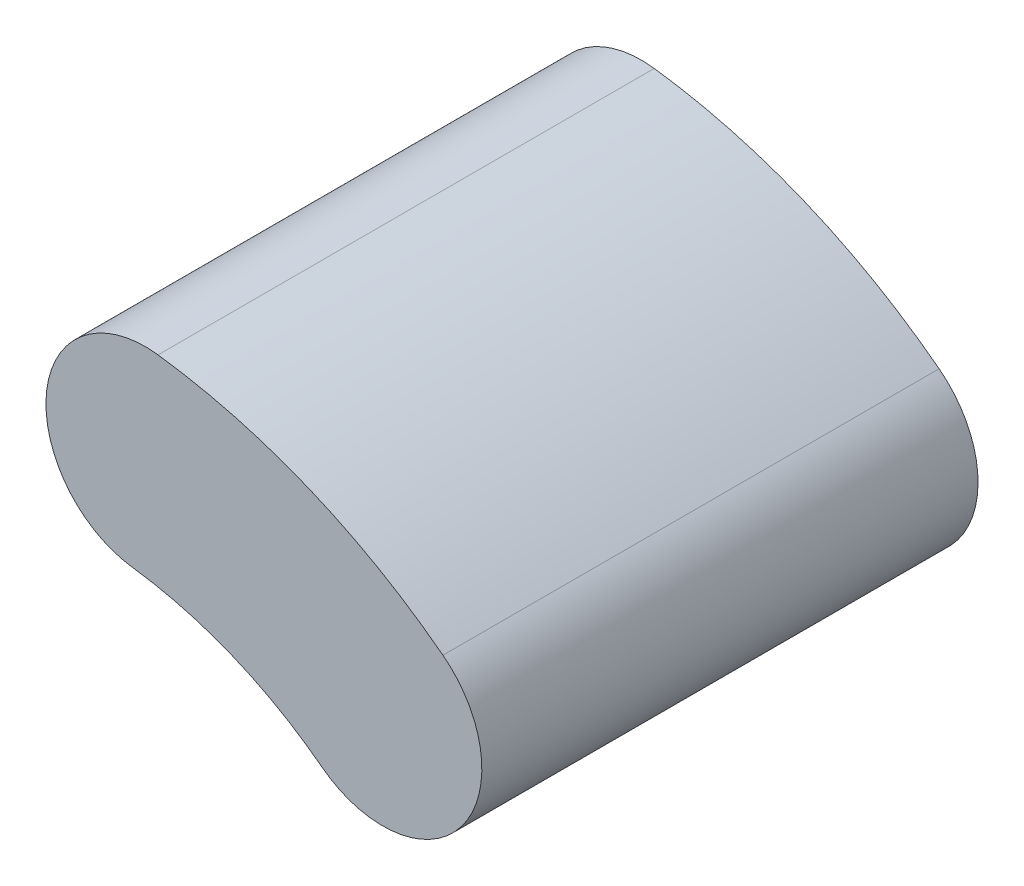
ISO-10303-21;
HEADER;
FILE_DESCRIPTION(('STEP AP214'),'2;1');
FILE_NAME('part.step','',(''),(''),'','','');
FILE_SCHEMA(('AUTOMOTIVE_DESIGN { 1 0 10303 214 1 1 1 1 }'));
ENDSEC;
DATA;
#1=APPLICATION_CONTEXT('core data for automotive mechanical design processes');
#2=APPLICATION_PROTOCOL_DEFINITION('international standard','automotive_design',2000,#1);
#3=PRODUCT_CONTEXT('',#1,'mechanical');
#4=PRODUCT('Part','Part','',(#3));
#5=PRODUCT_RELATED_PRODUCT_CATEGORY('part','',(#4));
#6=PRODUCT_DEFINITION_FORMATION('','',#4);
#7=PRODUCT_DEFINITION_CONTEXT('part definition',#1,'design');
#8=PRODUCT_DEFINITION('design','',#6,#7);
#9=PRODUCT_DEFINITION_SHAPE('','',#8);
#10=(LENGTH_UNIT() NAMED_UNIT(*) SI_UNIT(.MILLI.,.METRE.));
#11=(NAMED_UNIT(*) PLANE_ANGLE_UNIT() SI_UNIT($,.RADIAN.));
#12=(NAMED_UNIT(*) SI_UNIT($,.STERADIAN.) SOLID_ANGLE_UNIT());
#13=UNCERTAINTY_MEASURE_WITH_UNIT(LENGTH_MEASURE(1.E-05),#10,'distance_accuracy_value','');
#14=(GEOMETRIC_REPRESENTATION_CONTEXT(3) GLOBAL_UNCERTAINTY_ASSIGNED_CONTEXT((#13)) GLOBAL_UNIT_ASSIGNED_CONTEXT((#10,
#11,#12)) REPRESENTATION_CONTEXT('',''));
#15=CARTESIAN_POINT('',(0.,0.,0.));
#16=DIRECTION('',(0.,0.,1.));
#17=DIRECTION('',(1.,0.,0.));
#18=AXIS2_PLACEMENT_3D('',#15,#16,#17);
#19=CARTESIAN_POINT('',(60.7899855979453,79.4013705864175,100.));
#20=DIRECTION('',(0.,0.,-1.));
#21=DIRECTION('',(-1.,0.,0.));
#22=AXIS2_PLACEMENT_3D('',#19,#20,#21);
#23=CYLINDRICAL_SURFACE('',#22,20.);
#24=CARTESIAN_POINT('',(60.7899855979453,79.4013705864175,0.));
#25=DIRECTION('',(0.,0.,1.));
#26=DIRECTION('',(1.,0.,0.));
#27=AXIS2_PLACEMENT_3D('',#24,#25,#26);
#28=CIRCLE('',#27,20.);
#29=CARTESIAN_POINT('',(48.6319884783562,63.521096469134,0.));
#30=VERTEX_POINT('',#29);
#31=CARTESIAN_POINT('',(72.9479827175344,95.281644703701,0.));
#32=VERTEX_POINT('',#31);
#33=EDGE_CURVE('E100',#30,#32,#28,.T.);
#34=ORIENTED_EDGE('',*,*,#33,.T.);
#35=DIRECTION('',(0.,0.,-1.));
#36=VECTOR('',#35,1.);
#37=CARTESIAN_POINT('',(72.9479827175344,95.281644703701,100.));
#38=LINE('',#37,#36);
#39=CARTESIAN_POINT('',(72.9479827175344,95.281644703701,100.));
#40=VERTEX_POINT('',#39);
#41=EDGE_CURVE('E11',#40,#32,#38,.T.);
#42=ORIENTED_EDGE('',*,*,#41,.F.);
#43=CARTESIAN_POINT('',(60.7899855979453,79.4013705864175,100.));
#44=DIRECTION('',(0.,0.,1.));
#45=DIRECTION('',(1.,0.,0.));
#46=AXIS2_PLACEMENT_3D('',#43,#44,#45);
#47=CIRCLE('',#46,20.);
#48=CARTESIAN_POINT('',(48.6319884783562,63.521096469134,100.));
#49=VERTEX_POINT('',#48);
#50=EDGE_CURVE('E88',#49,#40,#47,.T.);
#51=ORIENTED_EDGE('',*,*,#50,.F.);
#52=DIRECTION('',(0.,0.,-1.));
#53=VECTOR('',#52,1.);
#54=CARTESIAN_POINT('',(48.6319884783562,63.521096469134,100.));
#55=LINE('',#54,#53);
#56=EDGE_CURVE('E96',#49,#30,#55,.T.);
#57=ORIENTED_EDGE('',*,*,#56,.T.);
#58=EDGE_LOOP('',(#34,#42,#51,#57));
#59=FACE_BOUND('',#58,.T.);
#60=ADVANCED_FACE('F37',(#59),#23,.T.);
#61=CARTESIAN_POINT('',(0.,0.,100.));
#62=DIRECTION('',(0.,0.,-1.));
#63=DIRECTION('',(-1.,0.,0.));
#64=AXIS2_PLACEMENT_3D('',#61,#62,#63);
#65=CYLINDRICAL_SURFACE('',#64,120.);
#66=CARTESIAN_POINT('',(0.,0.,0.));
#67=DIRECTION('',(0.,0.,1.));
#68=DIRECTION('',(1.,0.,0.));
#69=AXIS2_PLACEMENT_3D('',#66,#67,#68);
#70=CIRCLE('',#69,120.);
#71=CARTESIAN_POINT('',(15.5339838363623,118.990316186535,0.));
#72=VERTEX_POINT('',#71);
#73=EDGE_CURVE('E92',#32,#72,#70,.T.);
#74=ORIENTED_EDGE('',*,*,#73,.T.);
#75=DIRECTION('',(0.,0.,-1.));
#76=VECTOR('',#75,1.);
#77=CARTESIAN_POINT('',(15.5339838363623,118.990316186535,100.));
#78=LINE('',#77,#76);
#79=CARTESIAN_POINT('',(15.5339838363623,118.990316186535,100.));
#80=VERTEX_POINT('',#79);
#81=EDGE_CURVE('E45',#80,#72,#78,.T.);
#82=ORIENTED_EDGE('',*,*,#81,.F.);
#83=CARTESIAN_POINT('',(0.,0.,100.));
#84=DIRECTION('',(0.,0.,1.));
#85=DIRECTION('',(1.,0.,0.));
#86=AXIS2_PLACEMENT_3D('',#83,#84,#85);
#87=CIRCLE('',#86,120.);
#88=EDGE_CURVE('E83',#40,#80,#87,.T.);
#89=ORIENTED_EDGE('',*,*,#88,.F.);
#90=ORIENTED_EDGE('',*,*,#41,.T.);
#91=EDGE_LOOP('',(#74,#82,#89,#90));
#92=FACE_BOUND('',#91,.T.);
#93=ADVANCED_FACE('F91',(#92),#65,.T.);
#94=CARTESIAN_POINT('',(12.9449865303019,99.1585968221125,100.));
#95=DIRECTION('',(0.,0.,-1.));
#96=DIRECTION('',(-1.,0.,0.));
#97=AXIS2_PLACEMENT_3D('',#94,#95,#96);
#98=CYLINDRICAL_SURFACE('',#97,20.0000000000001);
#99=CARTESIAN_POINT('',(12.9449865303019,99.1585968221125,0.));
#100=DIRECTION('',(0.,0.,1.));
#101=DIRECTION('',(1.,0.,0.));
#102=AXIS2_PLACEMENT_3D('',#99,#100,#101);
#103=CIRCLE('',#102,20.0000000000001);
#104=CARTESIAN_POINT('',(10.3559892242415,79.3268774576899,0.));
#105=VERTEX_POINT('',#104);
#106=EDGE_CURVE('E70',#72,#105,#103,.T.);
#107=ORIENTED_EDGE('',*,*,#106,.T.);
#108=DIRECTION('',(0.,0.,-1.));
#109=VECTOR('',#108,1.);
#110=CARTESIAN_POINT('',(10.3559892242415,79.3268774576899,100.));
#111=LINE('',#110,#109);
#112=CARTESIAN_POINT('',(10.3559892242415,79.3268774576899,100.));
#113=VERTEX_POINT('',#112);
#114=EDGE_CURVE('E93',#113,#105,#111,.T.);
#115=ORIENTED_EDGE('',*,*,#114,.F.);
#116=CARTESIAN_POINT('',(12.9449865303019,99.1585968221125,100.));
#117=DIRECTION('',(0.,0.,1.));
#118=DIRECTION('',(1.,0.,0.));
#119=AXIS2_PLACEMENT_3D('',#116,#117,#118);
#120=CIRCLE('',#119,20.0000000000001);
#121=EDGE_CURVE('E86',#80,#113,#120,.T.);
#122=ORIENTED_EDGE('',*,*,#121,.F.);
#123=ORIENTED_EDGE('',*,*,#81,.T.);
#124=EDGE_LOOP('',(#107,#115,#122,#123));
#125=FACE_BOUND('',#124,.T.);
#126=ADVANCED_FACE('F94',(#125),#98,.T.);
#127=CARTESIAN_POINT('',(0.,0.,100.));
#128=DIRECTION('',(0.,0.,-1.));
#129=DIRECTION('',(-1.,0.,0.));
#130=AXIS2_PLACEMENT_3D('',#127,#128,#129);
#131=CYLINDRICAL_SURFACE('',#130,80.);
#132=CARTESIAN_POINT('',(0.,0.,0.));
#133=DIRECTION('',(0.,0.,-1.));
#134=DIRECTION('',(1.,0.,0.));
#135=AXIS2_PLACEMENT_3D('',#132,#133,#134);
#136=CIRCLE('',#135,80.);
#137=EDGE_CURVE('E76',#105,#30,#136,.T.);
#138=ORIENTED_EDGE('',*,*,#137,.T.);
#139=ORIENTED_EDGE('',*,*,#56,.F.);
#140=CARTESIAN_POINT('',(0.,0.,100.));
#141=DIRECTION('',(0.,0.,-1.));
#142=DIRECTION('',(1.,0.,0.));
#143=AXIS2_PLACEMENT_3D('',#140,#141,#142);
#144=CIRCLE('',#143,80.);
#145=EDGE_CURVE('E53',#113,#49,#144,.T.);
#146=ORIENTED_EDGE('',*,*,#145,.F.);
#147=ORIENTED_EDGE('',*,*,#114,.T.);
#148=EDGE_LOOP('',(#138,#139,#146,#147));
#149=FACE_BOUND('',#148,.T.);
#150=ADVANCED_FACE('F107',(#149),#131,.F.);
#151=CARTESIAN_POINT('',(30.3949927989726,39.7006852932087,100.));
#152=DIRECTION('',(0.,0.,1.));
#153=DIRECTION('',(1.,0.,0.));
#154=AXIS2_PLACEMENT_3D('',#151,#152,#153);
#155=PLANE('',#154);
#156=ORIENTED_EDGE('',*,*,#50,.T.);
#157=ORIENTED_EDGE('',*,*,#88,.T.);
#158=ORIENTED_EDGE('',*,*,#121,.T.);
#159=ORIENTED_EDGE('',*,*,#145,.T.);
#160=EDGE_LOOP('',(#156,#157,#158,#159));
#161=FACE_BOUND('',#160,.T.);
#162=ADVANCED_FACE('F84',(#161),#155,.T.);
#163=CARTESIAN_POINT('',(30.3949927989726,39.7006852932087,0.));
#164=DIRECTION('',(0.,0.,1.));
#165=DIRECTION('',(1.,0.,0.));
#166=AXIS2_PLACEMENT_3D('',#163,#164,#165);
#167=PLANE('',#166);
#168=ORIENTED_EDGE('',*,*,#33,.F.);
#169=ORIENTED_EDGE('',*,*,#137,.F.);
#170=ORIENTED_EDGE('',*,*,#106,.F.);
#171=ORIENTED_EDGE('',*,*,#73,.F.);
#172=EDGE_LOOP('',(#168,#169,#170,#171));
#173=FACE_BOUND('',#172,.T.);
#174=ADVANCED_FACE('F110',(#173),#167,.F.);
#175=CLOSED_SHELL('',(#60,#93,#126,#150,#162,#174));
#176=MANIFOLD_SOLID_BREP('B2',#175);
#177=ADVANCED_BREP_SHAPE_REPRESENTATION('',(#18,#176),#14);
#178=SHAPE_DEFINITION_REPRESENTATION(#9,#177);
ENDSEC;
END-ISO-10303-21;
